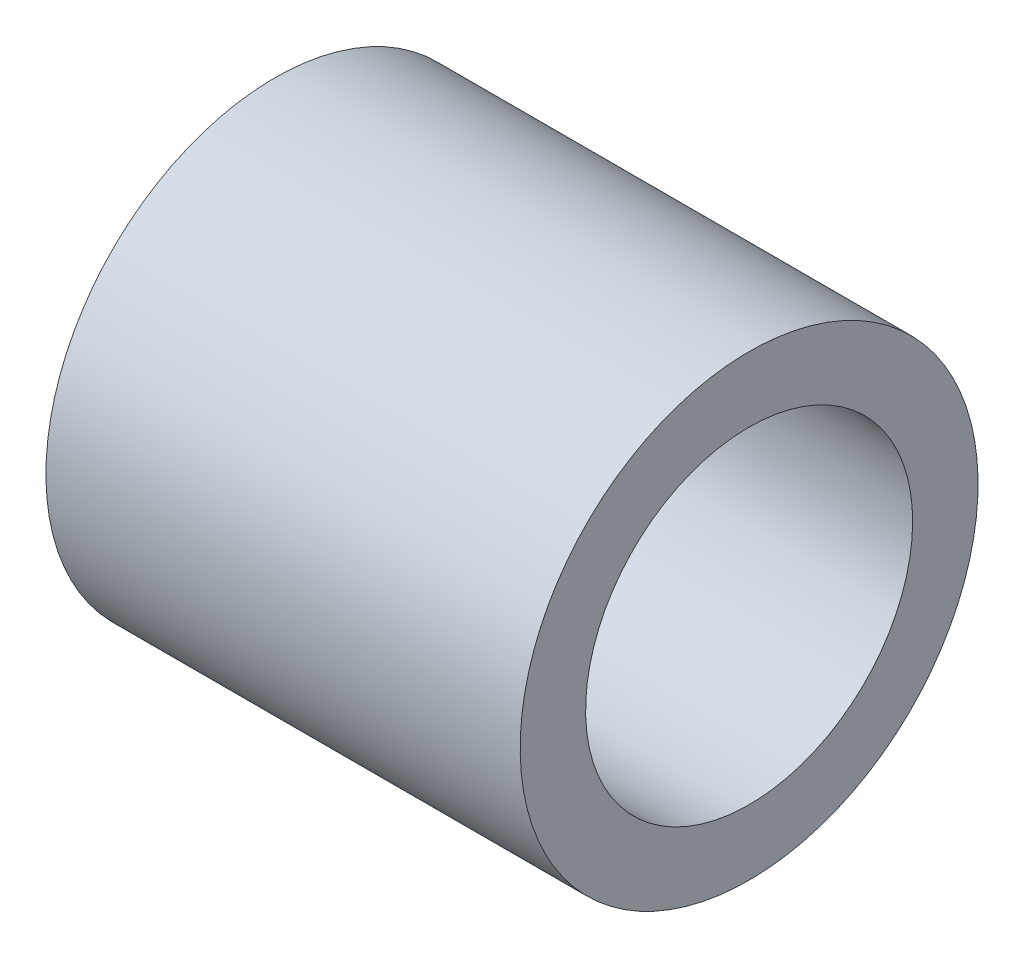
ISO-10303-21;
HEADER;
FILE_DESCRIPTION(('STEP AP214'),'2;1');
FILE_NAME('part.step','',(''),(''),'','','');
FILE_SCHEMA(('AUTOMOTIVE_DESIGN { 1 0 10303 214 1 1 1 1 }'));
ENDSEC;
DATA;
#1=APPLICATION_CONTEXT('core data for automotive mechanical design processes');
#2=APPLICATION_PROTOCOL_DEFINITION('international standard','automotive_design',2000,#1);
#3=PRODUCT_CONTEXT('',#1,'mechanical');
#4=PRODUCT('Part','Part','',(#3));
#5=PRODUCT_RELATED_PRODUCT_CATEGORY('part','',(#4));
#6=PRODUCT_DEFINITION_FORMATION('','',#4);
#7=PRODUCT_DEFINITION_CONTEXT('part definition',#1,'design');
#8=PRODUCT_DEFINITION('design','',#6,#7);
#9=PRODUCT_DEFINITION_SHAPE('','',#8);
#10=(LENGTH_UNIT() NAMED_UNIT(*) SI_UNIT(.MILLI.,.METRE.));
#11=(NAMED_UNIT(*) PLANE_ANGLE_UNIT() SI_UNIT($,.RADIAN.));
#12=(NAMED_UNIT(*) SI_UNIT($,.STERADIAN.) SOLID_ANGLE_UNIT());
#13=UNCERTAINTY_MEASURE_WITH_UNIT(LENGTH_MEASURE(1.E-05),#10,'distance_accuracy_value','');
#14=(GEOMETRIC_REPRESENTATION_CONTEXT(3) GLOBAL_UNCERTAINTY_ASSIGNED_CONTEXT((#13)) GLOBAL_UNIT_ASSIGNED_CONTEXT((#10,
#11,#12)) REPRESENTATION_CONTEXT('',''));
#15=CARTESIAN_POINT('',(0.,0.,0.));
#16=DIRECTION('',(0.,0.,1.));
#17=DIRECTION('',(1.,0.,0.));
#18=AXIS2_PLACEMENT_3D('',#15,#16,#17);
#19=CARTESIAN_POINT('',(6.,42.9,120.969863647503));
#20=DIRECTION('',(1.,0.,0.));
#21=DIRECTION('',(0.,-0.948451293798745,-0.316922929576715));
#22=AXIS2_PLACEMENT_3D('',#19,#20,#21);
#23=CYLINDRICAL_SURFACE('',#22,1.4);
#24=CARTESIAN_POINT('',(6.,42.9,120.969863647503));
#25=DIRECTION('',(1.,0.,0.));
#26=DIRECTION('',(0.,-0.948451293798745,-0.316922929576715));
#27=AXIS2_PLACEMENT_3D('',#24,#25,#26);
#28=CIRCLE('',#27,1.4);
#29=CARTESIAN_POINT('',(6.,41.5721681886818,120.526171546096));
#30=VERTEX_POINT('',#29);
#31=EDGE_CURVE('E11',#30,#30,#28,.T.);
#32=ORIENTED_EDGE('',*,*,#31,.T.);
#33=EDGE_LOOP('',(#32));
#34=FACE_BOUND('',#33,.T.);
#35=CARTESIAN_POINT('',(8.9,42.9,120.969863647503));
#36=DIRECTION('',(1.,0.,0.));
#37=DIRECTION('',(0.,-0.948451293798745,-0.316922929576715));
#38=AXIS2_PLACEMENT_3D('',#35,#36,#37);
#39=CIRCLE('',#38,1.4);
#40=CARTESIAN_POINT('',(8.9,41.5721681886818,120.526171546096));
#41=VERTEX_POINT('',#40);
#42=EDGE_CURVE('E71',#41,#41,#39,.T.);
#43=ORIENTED_EDGE('',*,*,#42,.F.);
#44=EDGE_LOOP('',(#43));
#45=FACE_BOUND('',#44,.T.);
#46=ADVANCED_FACE('F39',(#34,#45),#23,.T.);
#47=CARTESIAN_POINT('',(6.,42.9,120.969863647503));
#48=DIRECTION('',(1.,0.,0.));
#49=DIRECTION('',(0.,-0.948451293798745,-0.316922929576715));
#50=AXIS2_PLACEMENT_3D('',#47,#48,#49);
#51=PLANE('',#50);
#52=CARTESIAN_POINT('',(6.,42.9,120.969863647503));
#53=DIRECTION('',(1.,0.,0.));
#54=DIRECTION('',(0.,-0.948451293798745,-0.316922929576715));
#55=AXIS2_PLACEMENT_3D('',#52,#53,#54);
#56=CIRCLE('',#55,1.);
#57=CARTESIAN_POINT('',(6.,41.9515487062013,120.652940717926));
#58=VERTEX_POINT('',#57);
#59=EDGE_CURVE('E48',#58,#58,#56,.T.);
#60=ORIENTED_EDGE('',*,*,#59,.T.);
#61=EDGE_LOOP('',(#60));
#62=FACE_BOUND('',#61,.T.);
#63=ORIENTED_EDGE('',*,*,#31,.F.);
#64=EDGE_LOOP('',(#63));
#65=FACE_BOUND('',#64,.T.);
#66=ADVANCED_FACE('F89',(#62,#65),#51,.F.);
#67=CARTESIAN_POINT('',(8.9,42.9,120.969863647503));
#68=DIRECTION('',(-1.,0.,0.));
#69=DIRECTION('',(0.,0.948451293798745,0.316922929576715));
#70=AXIS2_PLACEMENT_3D('',#67,#68,#69);
#71=CYLINDRICAL_SURFACE('',#70,1.);
#72=CARTESIAN_POINT('',(8.9,42.9,120.969863647503));
#73=DIRECTION('',(1.,0.,0.));
#74=DIRECTION('',(0.,-0.948451293798745,-0.316922929576715));
#75=AXIS2_PLACEMENT_3D('',#72,#73,#74);
#76=CIRCLE('',#75,1.);
#77=CARTESIAN_POINT('',(8.9,41.9515487062013,120.652940717926));
#78=VERTEX_POINT('',#77);
#79=EDGE_CURVE('E42',#78,#78,#76,.T.);
#80=ORIENTED_EDGE('',*,*,#79,.T.);
#81=EDGE_LOOP('',(#80));
#82=FACE_BOUND('',#81,.T.);
#83=ORIENTED_EDGE('',*,*,#59,.F.);
#84=EDGE_LOOP('',(#83));
#85=FACE_BOUND('',#84,.T.);
#86=ADVANCED_FACE('F84',(#82,#85),#71,.F.);
#87=CARTESIAN_POINT('',(8.9,42.9,120.969863647503));
#88=DIRECTION('',(1.,0.,0.));
#89=DIRECTION('',(0.,-0.948451293798745,-0.316922929576715));
#90=AXIS2_PLACEMENT_3D('',#87,#88,#89);
#91=PLANE('',#90);
#92=ORIENTED_EDGE('',*,*,#79,.F.);
#93=EDGE_LOOP('',(#92));
#94=FACE_BOUND('',#93,.T.);
#95=ORIENTED_EDGE('',*,*,#42,.T.);
#96=EDGE_LOOP('',(#95));
#97=FACE_BOUND('',#96,.T.);
#98=ADVANCED_FACE('F72',(#94,#97),#91,.T.);
#99=CLOSED_SHELL('',(#46,#66,#86,#98));
#100=MANIFOLD_SOLID_BREP('B2',#99);
#101=ADVANCED_BREP_SHAPE_REPRESENTATION('',(#18,#100),#14);
#102=SHAPE_DEFINITION_REPRESENTATION(#9,#101);
ENDSEC;
END-ISO-10303-21;
